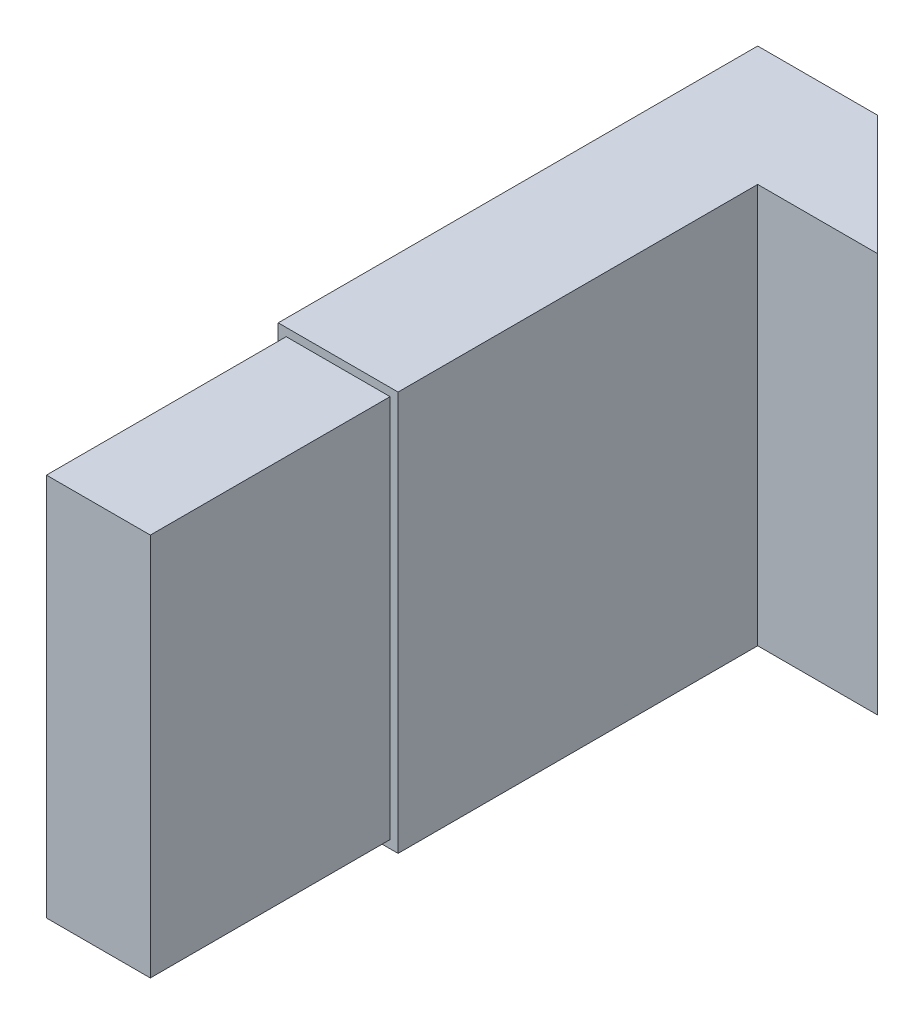
ISO-10303-21;
HEADER;
FILE_DESCRIPTION(('STEP AP214'),'2;1');
FILE_NAME('part.step','',(''),(''),'','','');
FILE_SCHEMA(('AUTOMOTIVE_DESIGN { 1 0 10303 214 1 1 1 1 }'));
ENDSEC;
DATA;
#1=APPLICATION_CONTEXT('core data for automotive mechanical design processes');
#2=APPLICATION_PROTOCOL_DEFINITION('international standard','automotive_design',2000,#1);
#3=PRODUCT_CONTEXT('',#1,'mechanical');
#4=PRODUCT('Part','Part','',(#3));
#5=PRODUCT_RELATED_PRODUCT_CATEGORY('part','',(#4));
#6=PRODUCT_DEFINITION_FORMATION('','',#4);
#7=PRODUCT_DEFINITION_CONTEXT('part definition',#1,'design');
#8=PRODUCT_DEFINITION('design','',#6,#7);
#9=PRODUCT_DEFINITION_SHAPE('','',#8);
#10=(LENGTH_UNIT() NAMED_UNIT(*) SI_UNIT(.MILLI.,.METRE.));
#11=(NAMED_UNIT(*) PLANE_ANGLE_UNIT() SI_UNIT($,.RADIAN.));
#12=(NAMED_UNIT(*) SI_UNIT($,.STERADIAN.) SOLID_ANGLE_UNIT());
#13=UNCERTAINTY_MEASURE_WITH_UNIT(LENGTH_MEASURE(1.E-05),#10,'distance_accuracy_value','');
#14=(GEOMETRIC_REPRESENTATION_CONTEXT(3) GLOBAL_UNCERTAINTY_ASSIGNED_CONTEXT((#13)) GLOBAL_UNIT_ASSIGNED_CONTEXT((#10,
#11,#12)) REPRESENTATION_CONTEXT('',''));
#15=CARTESIAN_POINT('',(0.,0.,0.));
#16=DIRECTION('',(0.,0.,1.));
#17=DIRECTION('',(1.,0.,0.));
#18=AXIS2_PLACEMENT_3D('',#15,#16,#17);
#19=CARTESIAN_POINT('',(0.,5.,3.));
#20=DIRECTION('',(0.,0.,-1.));
#21=DIRECTION('',(-1.,0.,0.));
#22=AXIS2_PLACEMENT_3D('',#19,#20,#21);
#23=PLANE('',#22);
#24=DIRECTION('',(1.,0.,0.));
#25=VECTOR('',#24,1.);
#26=CARTESIAN_POINT('',(0.,0.,3.));
#27=LINE('',#26,#25);
#28=CARTESIAN_POINT('',(-0.749999999999999,0.,3.));
#29=VERTEX_POINT('',#28);
#30=CARTESIAN_POINT('',(0.75,0.,3.));
#31=VERTEX_POINT('',#30);
#32=EDGE_CURVE('E145',#29,#31,#27,.T.);
#33=ORIENTED_EDGE('',*,*,#32,.T.);
#34=DIRECTION('',(0.,-1.,0.));
#35=VECTOR('',#34,1.);
#36=CARTESIAN_POINT('',(0.75,5.,3.));
#37=LINE('',#36,#35);
#38=CARTESIAN_POINT('',(0.75,5.,3.));
#39=VERTEX_POINT('',#38);
#40=EDGE_CURVE('E155',#39,#31,#37,.T.);
#41=ORIENTED_EDGE('',*,*,#40,.F.);
#42=DIRECTION('',(1.,0.,0.));
#43=VECTOR('',#42,1.);
#44=CARTESIAN_POINT('',(0.,5.,3.));
#45=LINE('',#44,#43);
#46=CARTESIAN_POINT('',(-0.749999999999999,5.,3.));
#47=VERTEX_POINT('',#46);
#48=EDGE_CURVE('E154',#47,#39,#45,.T.);
#49=ORIENTED_EDGE('',*,*,#48,.F.);
#50=DIRECTION('',(0.,-1.,0.));
#51=VECTOR('',#50,1.);
#52=CARTESIAN_POINT('',(-0.749999999999999,5.,3.));
#53=LINE('',#52,#51);
#54=EDGE_CURVE('E169',#47,#29,#53,.T.);
#55=ORIENTED_EDGE('',*,*,#54,.T.);
#56=EDGE_LOOP('',(#33,#41,#49,#55));
#57=FACE_BOUND('',#56,.T.);
#58=DIRECTION('',(0.,-1.,0.));
#59=VECTOR('',#58,1.);
#60=CARTESIAN_POINT('',(-0.649999999999999,4.9,3.));
#61=LINE('',#60,#59);
#62=CARTESIAN_POINT('',(-0.649999999999999,4.9,3.));
#63=VERTEX_POINT('',#62);
#64=CARTESIAN_POINT('',(-0.649999999999999,0.1,3.));
#65=VERTEX_POINT('',#64);
#66=EDGE_CURVE('E131',#63,#65,#61,.T.);
#67=ORIENTED_EDGE('',*,*,#66,.F.);
#68=DIRECTION('',(-1.,0.,0.));
#69=VECTOR('',#68,1.);
#70=CARTESIAN_POINT('',(0.65,4.9,3.));
#71=LINE('',#70,#69);
#72=CARTESIAN_POINT('',(0.65,4.9,3.));
#73=VERTEX_POINT('',#72);
#74=EDGE_CURVE('E128',#73,#63,#71,.T.);
#75=ORIENTED_EDGE('',*,*,#74,.F.);
#76=DIRECTION('',(0.,1.,0.));
#77=VECTOR('',#76,1.);
#78=CARTESIAN_POINT('',(0.65,0.1,3.));
#79=LINE('',#78,#77);
#80=CARTESIAN_POINT('',(0.65,0.0999999999999994,3.));
#81=VERTEX_POINT('',#80);
#82=EDGE_CURVE('E55',#81,#73,#79,.T.);
#83=ORIENTED_EDGE('',*,*,#82,.F.);
#84=DIRECTION('',(1.,0.,0.));
#85=VECTOR('',#84,1.);
#86=CARTESIAN_POINT('',(-0.649999999999999,0.1,3.));
#87=LINE('',#86,#85);
#88=EDGE_CURVE('E50',#65,#81,#87,.T.);
#89=ORIENTED_EDGE('',*,*,#88,.F.);
#90=EDGE_LOOP('',(#67,#75,#83,#89));
#91=FACE_BOUND('',#90,.T.);
#92=ADVANCED_FACE('F35',(#57,#91),#23,.F.);
#93=CARTESIAN_POINT('',(0.75,5.,0.));
#94=DIRECTION('',(1.,0.,0.));
#95=DIRECTION('',(0.,0.,-1.));
#96=AXIS2_PLACEMENT_3D('',#93,#94,#95);
#97=PLANE('',#96);
#98=DIRECTION('',(0.,0.,1.));
#99=VECTOR('',#98,1.);
#100=CARTESIAN_POINT('',(0.75,0.,0.));
#101=LINE('',#100,#99);
#102=CARTESIAN_POINT('',(0.75,0.,-1.5));
#103=VERTEX_POINT('',#102);
#104=EDGE_CURVE('E132',#103,#31,#101,.T.);
#105=ORIENTED_EDGE('',*,*,#104,.F.);
#106=DIRECTION('',(0.,-1.,0.));
#107=VECTOR('',#106,1.);
#108=CARTESIAN_POINT('',(0.75,5.,-1.5));
#109=LINE('',#108,#107);
#110=CARTESIAN_POINT('',(0.75,5.,-1.5));
#111=VERTEX_POINT('',#110);
#112=EDGE_CURVE('E11',#111,#103,#109,.T.);
#113=ORIENTED_EDGE('',*,*,#112,.F.);
#114=DIRECTION('',(0.,0.,1.));
#115=VECTOR('',#114,1.);
#116=CARTESIAN_POINT('',(0.75,5.,0.));
#117=LINE('',#116,#115);
#118=EDGE_CURVE('E141',#111,#39,#117,.T.);
#119=ORIENTED_EDGE('',*,*,#118,.T.);
#120=ORIENTED_EDGE('',*,*,#40,.T.);
#121=EDGE_LOOP('',(#105,#113,#119,#120));
#122=FACE_BOUND('',#121,.T.);
#123=ADVANCED_FACE('F37',(#122),#97,.T.);
#124=CARTESIAN_POINT('',(0.,5.,-1.5));
#125=DIRECTION('',(0.,0.,-1.));
#126=DIRECTION('',(-1.,0.,0.));
#127=AXIS2_PLACEMENT_3D('',#124,#125,#126);
#128=PLANE('',#127);
#129=DIRECTION('',(1.,0.,0.));
#130=VECTOR('',#129,1.);
#131=CARTESIAN_POINT('',(0.,0.,-1.5));
#132=LINE('',#131,#130);
#133=CARTESIAN_POINT('',(2.25,0.,-1.5));
#134=VERTEX_POINT('',#133);
#135=EDGE_CURVE('E135',#103,#134,#132,.T.);
#136=ORIENTED_EDGE('',*,*,#135,.T.);
#137=DIRECTION('',(0.,-1.,0.));
#138=VECTOR('',#137,1.);
#139=CARTESIAN_POINT('',(2.25,5.,-1.5));
#140=LINE('',#139,#138);
#141=CARTESIAN_POINT('',(2.25,5.,-1.5));
#142=VERTEX_POINT('',#141);
#143=EDGE_CURVE('E43',#142,#134,#140,.T.);
#144=ORIENTED_EDGE('',*,*,#143,.F.);
#145=DIRECTION('',(1.,0.,0.));
#146=VECTOR('',#145,1.);
#147=CARTESIAN_POINT('',(0.,5.,-1.5));
#148=LINE('',#147,#146);
#149=EDGE_CURVE('E144',#111,#142,#148,.T.);
#150=ORIENTED_EDGE('',*,*,#149,.F.);
#151=ORIENTED_EDGE('',*,*,#112,.T.);
#152=EDGE_LOOP('',(#136,#144,#150,#151));
#153=FACE_BOUND('',#152,.T.);
#154=ADVANCED_FACE('F199',(#153),#128,.F.);
#155=CARTESIAN_POINT('',(1.875,5.,-1.875));
#156=DIRECTION('',(-0.707106781186548,0.,0.707106781186547));
#157=DIRECTION('',(0.707106781186547,0.,0.707106781186548));
#158=AXIS2_PLACEMENT_3D('',#155,#156,#157);
#159=PLANE('',#158);
#160=DIRECTION('',(-0.707106781186547,0.,-0.707106781186548));
#161=VECTOR('',#160,1.);
#162=CARTESIAN_POINT('',(1.875,0.,-1.875));
#163=LINE('',#162,#161);
#164=CARTESIAN_POINT('',(0.75,0.,-3.));
#165=VERTEX_POINT('',#164);
#166=EDGE_CURVE('E158',#134,#165,#163,.T.);
#167=ORIENTED_EDGE('',*,*,#166,.T.);
#168=DIRECTION('',(0.,-1.,0.));
#169=VECTOR('',#168,1.);
#170=CARTESIAN_POINT('',(0.75,5.,-3.));
#171=LINE('',#170,#169);
#172=CARTESIAN_POINT('',(0.75,5.,-3.));
#173=VERTEX_POINT('',#172);
#174=EDGE_CURVE('E174',#173,#165,#171,.T.);
#175=ORIENTED_EDGE('',*,*,#174,.F.);
#176=DIRECTION('',(-0.707106781186547,0.,-0.707106781186548));
#177=VECTOR('',#176,1.);
#178=CARTESIAN_POINT('',(1.875,5.,-1.875));
#179=LINE('',#178,#177);
#180=EDGE_CURVE('E147',#142,#173,#179,.T.);
#181=ORIENTED_EDGE('',*,*,#180,.F.);
#182=ORIENTED_EDGE('',*,*,#143,.T.);
#183=EDGE_LOOP('',(#167,#175,#181,#182));
#184=FACE_BOUND('',#183,.T.);
#185=ADVANCED_FACE('F180',(#184),#159,.F.);
#186=CARTESIAN_POINT('',(0.,5.,-3.));
#187=DIRECTION('',(0.,0.,-1.));
#188=DIRECTION('',(-1.,0.,0.));
#189=AXIS2_PLACEMENT_3D('',#186,#187,#188);
#190=PLANE('',#189);
#191=DIRECTION('',(1.,0.,0.));
#192=VECTOR('',#191,1.);
#193=CARTESIAN_POINT('',(0.,0.,-3.));
#194=LINE('',#193,#192);
#195=CARTESIAN_POINT('',(-0.75,0.,-3.));
#196=VERTEX_POINT('',#195);
#197=EDGE_CURVE('E161',#196,#165,#194,.T.);
#198=ORIENTED_EDGE('',*,*,#197,.F.);
#199=DIRECTION('',(0.,-1.,0.));
#200=VECTOR('',#199,1.);
#201=CARTESIAN_POINT('',(-0.75,5.,-3.));
#202=LINE('',#201,#200);
#203=CARTESIAN_POINT('',(-0.75,5.,-3.));
#204=VERTEX_POINT('',#203);
#205=EDGE_CURVE('E172',#204,#196,#202,.T.);
#206=ORIENTED_EDGE('',*,*,#205,.F.);
#207=DIRECTION('',(1.,0.,0.));
#208=VECTOR('',#207,1.);
#209=CARTESIAN_POINT('',(0.,5.,-3.));
#210=LINE('',#209,#208);
#211=EDGE_CURVE('E149',#204,#173,#210,.T.);
#212=ORIENTED_EDGE('',*,*,#211,.T.);
#213=ORIENTED_EDGE('',*,*,#174,.T.);
#214=EDGE_LOOP('',(#198,#206,#212,#213));
#215=FACE_BOUND('',#214,.T.);
#216=ADVANCED_FACE('F192',(#215),#190,.T.);
#217=CARTESIAN_POINT('',(-0.75,5.,0.));
#218=DIRECTION('',(1.,0.,0.));
#219=DIRECTION('',(0.,0.,-1.));
#220=AXIS2_PLACEMENT_3D('',#217,#218,#219);
#221=PLANE('',#220);
#222=DIRECTION('',(0.,0.,1.));
#223=VECTOR('',#222,1.);
#224=CARTESIAN_POINT('',(-0.75,0.,0.));
#225=LINE('',#224,#223);
#226=EDGE_CURVE('E164',#196,#29,#225,.T.);
#227=ORIENTED_EDGE('',*,*,#226,.T.);
#228=ORIENTED_EDGE('',*,*,#54,.F.);
#229=DIRECTION('',(0.,0.,1.));
#230=VECTOR('',#229,1.);
#231=CARTESIAN_POINT('',(-0.75,5.,0.));
#232=LINE('',#231,#230);
#233=EDGE_CURVE('E152',#204,#47,#232,.T.);
#234=ORIENTED_EDGE('',*,*,#233,.F.);
#235=ORIENTED_EDGE('',*,*,#205,.T.);
#236=EDGE_LOOP('',(#227,#228,#234,#235));
#237=FACE_BOUND('',#236,.T.);
#238=ADVANCED_FACE('F205',(#237),#221,.F.);
#239=CARTESIAN_POINT('',(0.,5.,0.));
#240=DIRECTION('',(0.,1.,0.));
#241=DIRECTION('',(0.,0.,1.));
#242=AXIS2_PLACEMENT_3D('',#239,#240,#241);
#243=PLANE('',#242);
#244=ORIENTED_EDGE('',*,*,#118,.F.);
#245=ORIENTED_EDGE('',*,*,#149,.T.);
#246=ORIENTED_EDGE('',*,*,#180,.T.);
#247=ORIENTED_EDGE('',*,*,#211,.F.);
#248=ORIENTED_EDGE('',*,*,#233,.T.);
#249=ORIENTED_EDGE('',*,*,#48,.T.);
#250=EDGE_LOOP('',(#244,#245,#246,#247,#248,#249));
#251=FACE_BOUND('',#250,.T.);
#252=ADVANCED_FACE('F197',(#251),#243,.T.);
#253=CARTESIAN_POINT('',(0.,0.,0.));
#254=DIRECTION('',(0.,1.,0.));
#255=DIRECTION('',(0.,0.,1.));
#256=AXIS2_PLACEMENT_3D('',#253,#254,#255);
#257=PLANE('',#256);
#258=ORIENTED_EDGE('',*,*,#104,.T.);
#259=ORIENTED_EDGE('',*,*,#32,.F.);
#260=ORIENTED_EDGE('',*,*,#226,.F.);
#261=ORIENTED_EDGE('',*,*,#197,.T.);
#262=ORIENTED_EDGE('',*,*,#166,.F.);
#263=ORIENTED_EDGE('',*,*,#135,.F.);
#264=EDGE_LOOP('',(#258,#259,#260,#261,#262,#263));
#265=FACE_BOUND('',#264,.T.);
#266=ADVANCED_FACE('F186',(#265),#257,.F.);
#267=CARTESIAN_POINT('',(-0.649999999999999,4.9,6.));
#268=DIRECTION('',(1.,0.,0.));
#269=DIRECTION('',(0.,0.,-1.));
#270=AXIS2_PLACEMENT_3D('',#267,#268,#269);
#271=PLANE('',#270);
#272=ORIENTED_EDGE('',*,*,#66,.T.);
#273=DIRECTION('',(0.,0.,-1.));
#274=VECTOR('',#273,1.);
#275=CARTESIAN_POINT('',(-0.649999999999999,0.1,6.));
#276=LINE('',#275,#274);
#277=CARTESIAN_POINT('',(-0.649999999999999,0.1,6.));
#278=VERTEX_POINT('',#277);
#279=EDGE_CURVE('E112',#278,#65,#276,.T.);
#280=ORIENTED_EDGE('',*,*,#279,.F.);
#281=DIRECTION('',(0.,-1.,0.));
#282=VECTOR('',#281,1.);
#283=CARTESIAN_POINT('',(-0.649999999999999,4.9,6.));
#284=LINE('',#283,#282);
#285=CARTESIAN_POINT('',(-0.649999999999999,4.9,6.));
#286=VERTEX_POINT('',#285);
#287=EDGE_CURVE('E119',#286,#278,#284,.T.);
#288=ORIENTED_EDGE('',*,*,#287,.F.);
#289=DIRECTION('',(0.,0.,-1.));
#290=VECTOR('',#289,1.);
#291=CARTESIAN_POINT('',(-0.649999999999999,4.9,6.));
#292=LINE('',#291,#290);
#293=EDGE_CURVE('E320',#286,#63,#292,.T.);
#294=ORIENTED_EDGE('',*,*,#293,.T.);
#295=EDGE_LOOP('',(#272,#280,#288,#294));
#296=FACE_BOUND('',#295,.T.);
#297=ADVANCED_FACE('F130',(#296),#271,.F.);
#298=CARTESIAN_POINT('',(-0.649999999999999,0.1,6.));
#299=DIRECTION('',(0.,1.,0.));
#300=DIRECTION('',(0.,0.,1.));
#301=AXIS2_PLACEMENT_3D('',#298,#299,#300);
#302=PLANE('',#301);
#303=ORIENTED_EDGE('',*,*,#88,.T.);
#304=DIRECTION('',(0.,0.,-1.));
#305=VECTOR('',#304,1.);
#306=CARTESIAN_POINT('',(0.65,0.1,6.));
#307=LINE('',#306,#305);
#308=CARTESIAN_POINT('',(0.65,0.1,6.));
#309=VERTEX_POINT('',#308);
#310=EDGE_CURVE('E115',#309,#81,#307,.T.);
#311=ORIENTED_EDGE('',*,*,#310,.F.);
#312=DIRECTION('',(1.,0.,0.));
#313=VECTOR('',#312,1.);
#314=CARTESIAN_POINT('',(-0.649999999999999,0.1,6.));
#315=LINE('',#314,#313);
#316=EDGE_CURVE('E108',#278,#309,#315,.T.);
#317=ORIENTED_EDGE('',*,*,#316,.F.);
#318=ORIENTED_EDGE('',*,*,#279,.T.);
#319=EDGE_LOOP('',(#303,#311,#317,#318));
#320=FACE_BOUND('',#319,.T.);
#321=ADVANCED_FACE('F110',(#320),#302,.F.);
#322=CARTESIAN_POINT('',(0.65,0.1,6.));
#323=DIRECTION('',(-1.,0.,0.));
#324=DIRECTION('',(0.,0.,1.));
#325=AXIS2_PLACEMENT_3D('',#322,#323,#324);
#326=PLANE('',#325);
#327=ORIENTED_EDGE('',*,*,#82,.T.);
#328=DIRECTION('',(0.,0.,-1.));
#329=VECTOR('',#328,1.);
#330=CARTESIAN_POINT('',(0.65,4.9,6.));
#331=LINE('',#330,#329);
#332=CARTESIAN_POINT('',(0.65,4.9,6.));
#333=VERTEX_POINT('',#332);
#334=EDGE_CURVE('E137',#333,#73,#331,.T.);
#335=ORIENTED_EDGE('',*,*,#334,.F.);
#336=DIRECTION('',(0.,1.,0.));
#337=VECTOR('',#336,1.);
#338=CARTESIAN_POINT('',(0.65,0.1,6.));
#339=LINE('',#338,#337);
#340=EDGE_CURVE('E118',#309,#333,#339,.T.);
#341=ORIENTED_EDGE('',*,*,#340,.F.);
#342=ORIENTED_EDGE('',*,*,#310,.T.);
#343=EDGE_LOOP('',(#327,#335,#341,#342));
#344=FACE_BOUND('',#343,.T.);
#345=ADVANCED_FACE('F226',(#344),#326,.F.);
#346=CARTESIAN_POINT('',(0.65,4.9,6.));
#347=DIRECTION('',(0.,-1.,0.));
#348=DIRECTION('',(0.,0.,-1.));
#349=AXIS2_PLACEMENT_3D('',#346,#347,#348);
#350=PLANE('',#349);
#351=ORIENTED_EDGE('',*,*,#74,.T.);
#352=ORIENTED_EDGE('',*,*,#293,.F.);
#353=DIRECTION('',(-1.,0.,0.));
#354=VECTOR('',#353,1.);
#355=CARTESIAN_POINT('',(0.65,4.9,6.));
#356=LINE('',#355,#354);
#357=EDGE_CURVE('E124',#333,#286,#356,.T.);
#358=ORIENTED_EDGE('',*,*,#357,.F.);
#359=ORIENTED_EDGE('',*,*,#334,.T.);
#360=EDGE_LOOP('',(#351,#352,#358,#359));
#361=FACE_BOUND('',#360,.T.);
#362=ADVANCED_FACE('F229',(#361),#350,.F.);
#363=CARTESIAN_POINT('',(0.,0.,6.));
#364=DIRECTION('',(0.,0.,1.));
#365=DIRECTION('',(1.,0.,0.));
#366=AXIS2_PLACEMENT_3D('',#363,#364,#365);
#367=PLANE('',#366);
#368=ORIENTED_EDGE('',*,*,#287,.T.);
#369=ORIENTED_EDGE('',*,*,#316,.T.);
#370=ORIENTED_EDGE('',*,*,#340,.T.);
#371=ORIENTED_EDGE('',*,*,#357,.T.);
#372=EDGE_LOOP('',(#368,#369,#370,#371));
#373=FACE_BOUND('',#372,.T.);
#374=ADVANCED_FACE('F122',(#373),#367,.T.);
#375=CLOSED_SHELL('',(#92,#123,#154,#185,#216,#238,#252,#266,#297,#321,#345,#362,#374));
#376=MANIFOLD_SOLID_BREP('B2',#375);
#377=ADVANCED_BREP_SHAPE_REPRESENTATION('',(#18,#376),#14);
#378=SHAPE_DEFINITION_REPRESENTATION(#9,#377);
ENDSEC;
END-ISO-10303-21;
